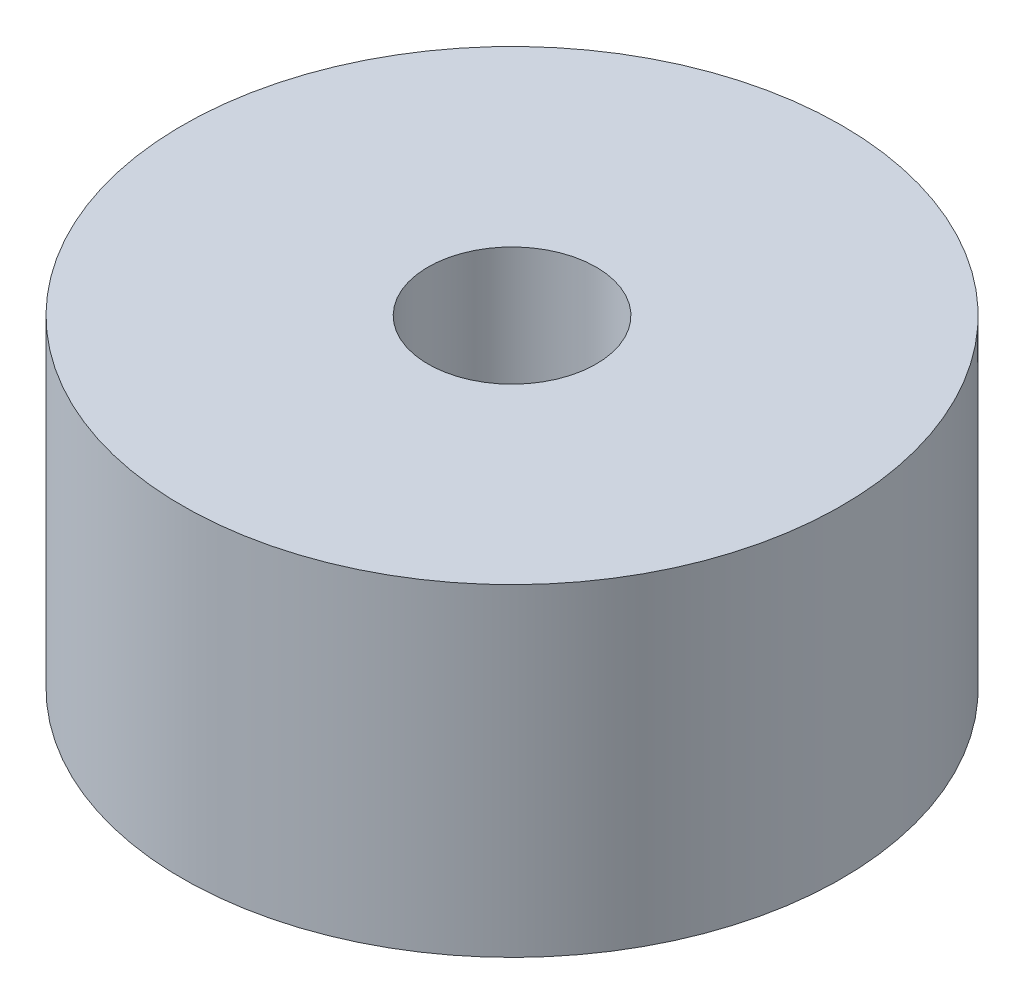
ISO-10303-21;
HEADER;
FILE_DESCRIPTION(('STEP AP214'),'2;1');
FILE_NAME('part.step','',(''),(''),'','','');
FILE_SCHEMA(('AUTOMOTIVE_DESIGN { 1 0 10303 214 1 1 1 1 }'));
ENDSEC;
DATA;
#1=APPLICATION_CONTEXT('core data for automotive mechanical design processes');
#2=APPLICATION_PROTOCOL_DEFINITION('international standard','automotive_design',2000,#1);
#3=PRODUCT_CONTEXT('',#1,'mechanical');
#4=PRODUCT('Part','Part','',(#3));
#5=PRODUCT_RELATED_PRODUCT_CATEGORY('part','',(#4));
#6=PRODUCT_DEFINITION_FORMATION('','',#4);
#7=PRODUCT_DEFINITION_CONTEXT('part definition',#1,'design');
#8=PRODUCT_DEFINITION('design','',#6,#7);
#9=PRODUCT_DEFINITION_SHAPE('','',#8);
#10=(LENGTH_UNIT() NAMED_UNIT(*) SI_UNIT(.MILLI.,.METRE.));
#11=(NAMED_UNIT(*) PLANE_ANGLE_UNIT() SI_UNIT($,.RADIAN.));
#12=(NAMED_UNIT(*) SI_UNIT($,.STERADIAN.) SOLID_ANGLE_UNIT());
#13=UNCERTAINTY_MEASURE_WITH_UNIT(LENGTH_MEASURE(1.E-05),#10,'distance_accuracy_value','');
#14=(GEOMETRIC_REPRESENTATION_CONTEXT(3) GLOBAL_UNCERTAINTY_ASSIGNED_CONTEXT((#13)) GLOBAL_UNIT_ASSIGNED_CONTEXT((#10,
#11,#12)) REPRESENTATION_CONTEXT('',''));
#15=CARTESIAN_POINT('',(0.,0.,0.));
#16=DIRECTION('',(0.,0.,1.));
#17=DIRECTION('',(1.,0.,0.));
#18=AXIS2_PLACEMENT_3D('',#15,#16,#17);
#19=CARTESIAN_POINT('',(0.,6.096,0.));
#20=DIRECTION('',(0.,1.,0.));
#21=DIRECTION('',(0.,0.,1.));
#22=AXIS2_PLACEMENT_3D('',#19,#20,#21);
#23=PLANE('',#22);
#24=CARTESIAN_POINT('',(0.,6.096,0.));
#25=DIRECTION('',(0.,1.,0.));
#26=DIRECTION('',(0.,0.,1.));
#27=AXIS2_PLACEMENT_3D('',#24,#25,#26);
#28=CIRCLE('',#27,6.223);
#29=CARTESIAN_POINT('',(0.,6.096,-6.223));
#30=VERTEX_POINT('',#29);
#31=EDGE_CURVE('E10',#30,#30,#28,.T.);
#32=ORIENTED_EDGE('',*,*,#31,.T.);
#33=EDGE_LOOP('',(#32));
#34=FACE_BOUND('',#33,.T.);
#35=CARTESIAN_POINT('',(0.,6.096,0.));
#36=DIRECTION('',(0.,1.,0.));
#37=DIRECTION('',(0.,0.,1.));
#38=AXIS2_PLACEMENT_3D('',#35,#36,#37);
#39=CIRCLE('',#38,1.5875);
#40=CARTESIAN_POINT('',(0.,6.096,-1.5875));
#41=VERTEX_POINT('',#40);
#42=EDGE_CURVE('E48',#41,#41,#39,.T.);
#43=ORIENTED_EDGE('',*,*,#42,.F.);
#44=EDGE_LOOP('',(#43));
#45=FACE_BOUND('',#44,.T.);
#46=ADVANCED_FACE('F37',(#34,#45),#23,.T.);
#47=CARTESIAN_POINT('',(0.,0.,0.));
#48=DIRECTION('',(0.,1.,0.));
#49=DIRECTION('',(0.,0.,1.));
#50=AXIS2_PLACEMENT_3D('',#47,#48,#49);
#51=PLANE('',#50);
#52=CARTESIAN_POINT('',(0.,0.,0.));
#53=DIRECTION('',(0.,1.,0.));
#54=DIRECTION('',(0.,0.,1.));
#55=AXIS2_PLACEMENT_3D('',#52,#53,#54);
#56=CIRCLE('',#55,6.223);
#57=CARTESIAN_POINT('',(0.,0.,-6.223));
#58=VERTEX_POINT('',#57);
#59=EDGE_CURVE('E41',#58,#58,#56,.T.);
#60=ORIENTED_EDGE('',*,*,#59,.F.);
#61=EDGE_LOOP('',(#60));
#62=FACE_BOUND('',#61,.T.);
#63=CARTESIAN_POINT('',(0.,0.,0.));
#64=DIRECTION('',(0.,1.,0.));
#65=DIRECTION('',(0.,0.,1.));
#66=AXIS2_PLACEMENT_3D('',#63,#64,#65);
#67=CIRCLE('',#66,1.5875);
#68=CARTESIAN_POINT('',(0.,0.,-1.5875));
#69=VERTEX_POINT('',#68);
#70=EDGE_CURVE('E50',#69,#69,#67,.T.);
#71=ORIENTED_EDGE('',*,*,#70,.T.);
#72=EDGE_LOOP('',(#71));
#73=FACE_BOUND('',#72,.T.);
#74=ADVANCED_FACE('F60',(#62,#73),#51,.F.);
#75=CARTESIAN_POINT('',(0.,6.096,0.));
#76=DIRECTION('',(0.,-1.,0.));
#77=DIRECTION('',(0.,0.,-1.));
#78=AXIS2_PLACEMENT_3D('',#75,#76,#77);
#79=CYLINDRICAL_SURFACE('',#78,6.223);
#80=CARTESIAN_POINT('',(0.,6.096,-6.223));
#81=CARTESIAN_POINT('',(0.,6.0325,-6.223));
#82=CARTESIAN_POINT('',(0.,5.969,-6.223));
#83=CARTESIAN_POINT('',(0.,5.842,-6.223));
#84=CARTESIAN_POINT('',(0.,5.7785,-6.223));
#85=CARTESIAN_POINT('',(0.,5.6515,-6.223));
#86=CARTESIAN_POINT('',(0.,5.588,-6.223));
#87=CARTESIAN_POINT('',(0.,5.461,-6.223));
#88=CARTESIAN_POINT('',(0.,5.3975,-6.223));
#89=CARTESIAN_POINT('',(0.,5.2705,-6.223));
#90=CARTESIAN_POINT('',(0.,5.207,-6.223));
#91=CARTESIAN_POINT('',(0.,5.08,-6.223));
#92=CARTESIAN_POINT('',(0.,5.0165,-6.223));
#93=CARTESIAN_POINT('',(0.,4.8895,-6.223));
#94=CARTESIAN_POINT('',(0.,4.826,-6.223));
#95=CARTESIAN_POINT('',(0.,4.699,-6.223));
#96=CARTESIAN_POINT('',(0.,4.6355,-6.223));
#97=CARTESIAN_POINT('',(0.,4.5085,-6.223));
#98=CARTESIAN_POINT('',(0.,4.445,-6.223));
#99=CARTESIAN_POINT('',(0.,4.318,-6.223));
#100=CARTESIAN_POINT('',(0.,4.2545,-6.223));
#101=CARTESIAN_POINT('',(0.,4.1275,-6.223));
#102=CARTESIAN_POINT('',(0.,4.064,-6.223));
#103=CARTESIAN_POINT('',(0.,3.937,-6.223));
#104=CARTESIAN_POINT('',(0.,3.8735,-6.223));
#105=CARTESIAN_POINT('',(0.,3.7465,-6.223));
#106=CARTESIAN_POINT('',(0.,3.683,-6.223));
#107=CARTESIAN_POINT('',(0.,3.556,-6.223));
#108=CARTESIAN_POINT('',(0.,3.4925,-6.223));
#109=CARTESIAN_POINT('',(0.,3.3655,-6.223));
#110=CARTESIAN_POINT('',(0.,3.302,-6.223));
#111=CARTESIAN_POINT('',(0.,3.175,-6.223));
#112=CARTESIAN_POINT('',(0.,3.1115,-6.223));
#113=CARTESIAN_POINT('',(0.,2.9845,-6.223));
#114=CARTESIAN_POINT('',(0.,2.921,-6.223));
#115=CARTESIAN_POINT('',(0.,2.794,-6.223));
#116=CARTESIAN_POINT('',(0.,2.7305,-6.223));
#117=CARTESIAN_POINT('',(0.,2.6035,-6.223));
#118=CARTESIAN_POINT('',(0.,2.54,-6.223));
#119=CARTESIAN_POINT('',(0.,2.413,-6.223));
#120=CARTESIAN_POINT('',(0.,2.3495,-6.223));
#121=CARTESIAN_POINT('',(0.,2.2225,-6.223));
#122=CARTESIAN_POINT('',(0.,2.159,-6.223));
#123=CARTESIAN_POINT('',(0.,2.032,-6.223));
#124=CARTESIAN_POINT('',(0.,1.9685,-6.223));
#125=CARTESIAN_POINT('',(0.,1.8415,-6.223));
#126=CARTESIAN_POINT('',(0.,1.778,-6.223));
#127=CARTESIAN_POINT('',(0.,1.651,-6.223));
#128=CARTESIAN_POINT('',(0.,1.5875,-6.223));
#129=CARTESIAN_POINT('',(0.,1.4605,-6.223));
#130=CARTESIAN_POINT('',(0.,1.397,-6.223));
#131=CARTESIAN_POINT('',(0.,1.27,-6.223));
#132=CARTESIAN_POINT('',(0.,1.2065,-6.223));
#133=CARTESIAN_POINT('',(0.,1.0795,-6.223));
#134=CARTESIAN_POINT('',(0.,1.016,-6.223));
#135=CARTESIAN_POINT('',(0.,0.889,-6.223));
#136=CARTESIAN_POINT('',(0.,0.8255,-6.223));
#137=CARTESIAN_POINT('',(0.,0.6985,-6.223));
#138=CARTESIAN_POINT('',(0.,0.635,-6.223));
#139=CARTESIAN_POINT('',(0.,0.508,-6.223));
#140=CARTESIAN_POINT('',(0.,0.4445,-6.223));
#141=CARTESIAN_POINT('',(0.,0.3175,-6.223));
#142=CARTESIAN_POINT('',(0.,0.254,-6.223));
#143=CARTESIAN_POINT('',(0.,0.127,-6.223));
#144=CARTESIAN_POINT('',(0.,0.0634999999999999,-6.223));
#145=CARTESIAN_POINT('',(0.,0.,-6.223));
#146=B_SPLINE_CURVE_WITH_KNOTS('',3,(#80,#81,#82,#83,#84,#85,#86,#87,#88,#89,#90,#91,#92,#93,
#94,#95,#96,#97,#98,#99,#100,#101,#102,#103,#104,#105,#106,#107,#108,#109,#110,#111,#112,#113,
#114,#115,#116,#117,#118,#119,#120,#121,#122,#123,#124,#125,#126,#127,#128,#129,#130,#131,#132,
#133,#134,#135,#136,#137,#138,#139,#140,#141,#142,#143,#144,#145),.UNSPECIFIED.,.F.,.F.,(4,2,2,
2,2,2,2,2,2,2,2,2,2,2,2,2,2,2,2,2,2,2,2,2,2,2,2,2,2,2,2,2,4),(0.,0.1905,0.380999999999999,
0.571499999999999,0.762,0.952499999999999,1.143,1.3335,1.524,1.7145,1.905,2.0955,2.286,2.4765,
2.667,2.8575,3.048,3.2385,3.429,3.6195,3.81,4.0005,4.191,4.3815,4.572,4.7625,4.953,5.1435,5.334,
5.5245,5.715,5.9055,6.096),.UNSPECIFIED.);
#147=EDGE_CURVE('BSEAM39',#30,#58,#146,.T.);
#148=ORIENTED_EDGE('',*,*,#31,.F.);
#149=ORIENTED_EDGE('',*,*,#59,.T.);
#150=ORIENTED_EDGE('',*,*,#147,.T.);
#151=ORIENTED_EDGE('',*,*,#147,.F.);
#152=EDGE_LOOP('',(#148,#150,#149,#151));
#153=FACE_BOUND('',#152,.T.);
#154=ADVANCED_FACE('F39',(#153),#79,.T.);
#155=CARTESIAN_POINT('',(0.,6.096,0.));
#156=DIRECTION('',(0.,-1.,0.));
#157=DIRECTION('',(0.,0.,-1.));
#158=AXIS2_PLACEMENT_3D('',#155,#156,#157);
#159=CYLINDRICAL_SURFACE('',#158,1.5875);
#160=CARTESIAN_POINT('',(0.,6.096,-1.5875));
#161=CARTESIAN_POINT('',(0.,6.0325,-1.5875));
#162=CARTESIAN_POINT('',(0.,5.969,-1.5875));
#163=CARTESIAN_POINT('',(0.,5.842,-1.5875));
#164=CARTESIAN_POINT('',(0.,5.7785,-1.5875));
#165=CARTESIAN_POINT('',(0.,5.6515,-1.5875));
#166=CARTESIAN_POINT('',(0.,5.588,-1.5875));
#167=CARTESIAN_POINT('',(0.,5.461,-1.5875));
#168=CARTESIAN_POINT('',(0.,5.3975,-1.5875));
#169=CARTESIAN_POINT('',(0.,5.2705,-1.5875));
#170=CARTESIAN_POINT('',(0.,5.207,-1.5875));
#171=CARTESIAN_POINT('',(0.,5.08,-1.5875));
#172=CARTESIAN_POINT('',(0.,5.0165,-1.5875));
#173=CARTESIAN_POINT('',(0.,4.8895,-1.5875));
#174=CARTESIAN_POINT('',(0.,4.826,-1.5875));
#175=CARTESIAN_POINT('',(0.,4.699,-1.5875));
#176=CARTESIAN_POINT('',(0.,4.6355,-1.5875));
#177=CARTESIAN_POINT('',(0.,4.5085,-1.5875));
#178=CARTESIAN_POINT('',(0.,4.445,-1.5875));
#179=CARTESIAN_POINT('',(0.,4.318,-1.5875));
#180=CARTESIAN_POINT('',(0.,4.2545,-1.5875));
#181=CARTESIAN_POINT('',(0.,4.1275,-1.5875));
#182=CARTESIAN_POINT('',(0.,4.064,-1.5875));
#183=CARTESIAN_POINT('',(0.,3.937,-1.5875));
#184=CARTESIAN_POINT('',(0.,3.8735,-1.5875));
#185=CARTESIAN_POINT('',(0.,3.7465,-1.5875));
#186=CARTESIAN_POINT('',(0.,3.683,-1.5875));
#187=CARTESIAN_POINT('',(0.,3.556,-1.5875));
#188=CARTESIAN_POINT('',(0.,3.4925,-1.5875));
#189=CARTESIAN_POINT('',(0.,3.3655,-1.5875));
#190=CARTESIAN_POINT('',(0.,3.302,-1.5875));
#191=CARTESIAN_POINT('',(0.,3.175,-1.5875));
#192=CARTESIAN_POINT('',(0.,3.1115,-1.5875));
#193=CARTESIAN_POINT('',(0.,2.9845,-1.5875));
#194=CARTESIAN_POINT('',(0.,2.921,-1.5875));
#195=CARTESIAN_POINT('',(0.,2.794,-1.5875));
#196=CARTESIAN_POINT('',(0.,2.7305,-1.5875));
#197=CARTESIAN_POINT('',(0.,2.6035,-1.5875));
#198=CARTESIAN_POINT('',(0.,2.54,-1.5875));
#199=CARTESIAN_POINT('',(0.,2.413,-1.5875));
#200=CARTESIAN_POINT('',(0.,2.3495,-1.5875));
#201=CARTESIAN_POINT('',(0.,2.2225,-1.5875));
#202=CARTESIAN_POINT('',(0.,2.159,-1.5875));
#203=CARTESIAN_POINT('',(0.,2.032,-1.5875));
#204=CARTESIAN_POINT('',(0.,1.9685,-1.5875));
#205=CARTESIAN_POINT('',(0.,1.8415,-1.5875));
#206=CARTESIAN_POINT('',(0.,1.778,-1.5875));
#207=CARTESIAN_POINT('',(0.,1.651,-1.5875));
#208=CARTESIAN_POINT('',(0.,1.5875,-1.5875));
#209=CARTESIAN_POINT('',(0.,1.4605,-1.5875));
#210=CARTESIAN_POINT('',(0.,1.397,-1.5875));
#211=CARTESIAN_POINT('',(0.,1.27,-1.5875));
#212=CARTESIAN_POINT('',(0.,1.2065,-1.5875));
#213=CARTESIAN_POINT('',(0.,1.0795,-1.5875));
#214=CARTESIAN_POINT('',(0.,1.016,-1.5875));
#215=CARTESIAN_POINT('',(0.,0.889,-1.5875));
#216=CARTESIAN_POINT('',(0.,0.8255,-1.5875));
#217=CARTESIAN_POINT('',(0.,0.6985,-1.5875));
#218=CARTESIAN_POINT('',(0.,0.635,-1.5875));
#219=CARTESIAN_POINT('',(0.,0.508,-1.5875));
#220=CARTESIAN_POINT('',(0.,0.4445,-1.5875));
#221=CARTESIAN_POINT('',(0.,0.3175,-1.5875));
#222=CARTESIAN_POINT('',(0.,0.254,-1.5875));
#223=CARTESIAN_POINT('',(0.,0.127,-1.5875));
#224=CARTESIAN_POINT('',(0.,0.0634999999999999,-1.5875));
#225=CARTESIAN_POINT('',(0.,0.,-1.5875));
#226=B_SPLINE_CURVE_WITH_KNOTS('',3,(#160,#161,#162,#163,#164,#165,#166,#167,#168,#169,#170,
#171,#172,#173,#174,#175,#176,#177,#178,#179,#180,#181,#182,#183,#184,#185,#186,#187,#188,#189,
#190,#191,#192,#193,#194,#195,#196,#197,#198,#199,#200,#201,#202,#203,#204,#205,#206,#207,#208,
#209,#210,#211,#212,#213,#214,#215,#216,#217,#218,#219,#220,#221,#222,#223,#224,#225),
.UNSPECIFIED.,.F.,.F.,(4,2,2,2,2,2,2,2,2,2,2,2,2,2,2,2,2,2,2,2,2,2,2,2,2,2,2,2,2,2,2,2,4),(0.,
0.190500000000001,0.381,0.5715,0.762000000000001,0.9525,1.143,1.3335,1.524,1.7145,1.905,2.0955,
2.286,2.4765,2.667,2.8575,3.048,3.2385,3.429,3.6195,3.81,4.0005,4.191,4.3815,4.572,4.7625,4.953,
5.1435,5.334,5.5245,5.715,5.9055,6.096),.UNSPECIFIED.);
#227=EDGE_CURVE('BSEAM56',#41,#69,#226,.T.);
#228=ORIENTED_EDGE('',*,*,#42,.T.);
#229=ORIENTED_EDGE('',*,*,#70,.F.);
#230=ORIENTED_EDGE('',*,*,#227,.T.);
#231=ORIENTED_EDGE('',*,*,#227,.F.);
#232=EDGE_LOOP('',(#228,#230,#229,#231));
#233=FACE_BOUND('',#232,.T.);
#234=ADVANCED_FACE('F56',(#233),#159,.F.);
#235=CLOSED_SHELL('',(#46,#74,#154,#234));
#236=MANIFOLD_SOLID_BREP('B2',#235);
#237=ADVANCED_BREP_SHAPE_REPRESENTATION('',(#18,#236),#14);
#238=SHAPE_DEFINITION_REPRESENTATION(#9,#237);
ENDSEC;
END-ISO-10303-21;
